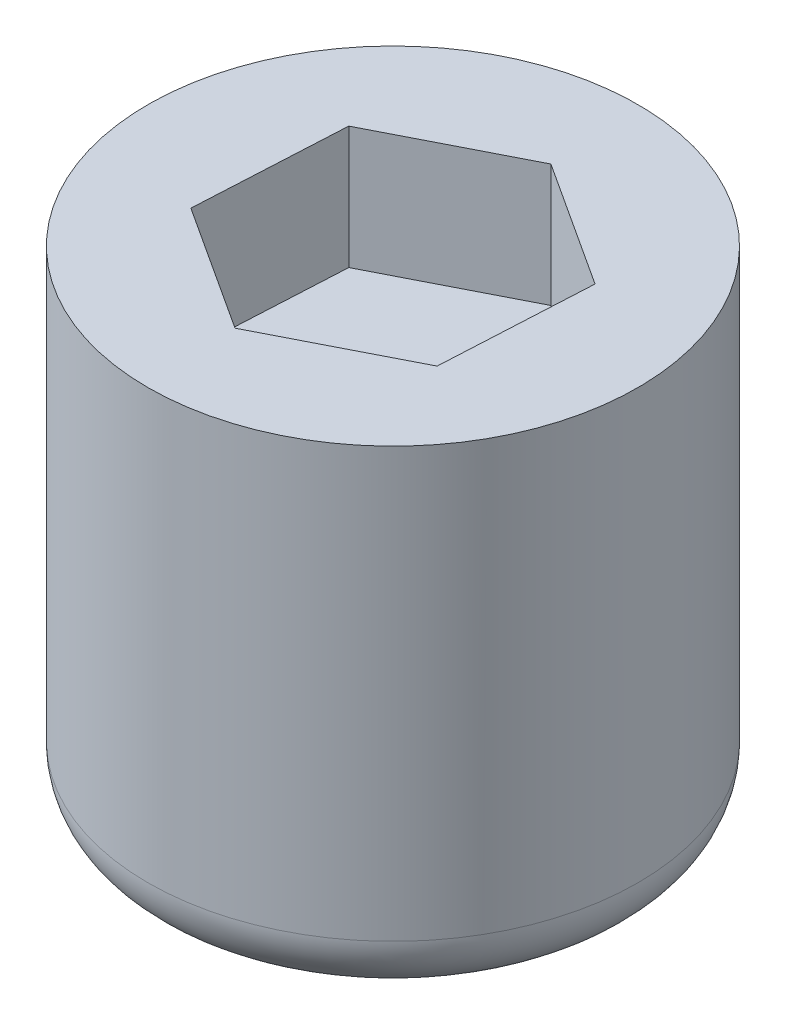
ISO-10303-21;
HEADER;
FILE_DESCRIPTION(('STEP AP214'),'2;1');
FILE_NAME('part.step','',(''),(''),'','','');
FILE_SCHEMA(('AUTOMOTIVE_DESIGN { 1 0 10303 214 1 1 1 1 }'));
ENDSEC;
DATA;
#1=APPLICATION_CONTEXT('core data for automotive mechanical design processes');
#2=APPLICATION_PROTOCOL_DEFINITION('international standard','automotive_design',2000,#1);
#3=PRODUCT_CONTEXT('',#1,'mechanical');
#4=PRODUCT('Part','Part','',(#3));
#5=PRODUCT_RELATED_PRODUCT_CATEGORY('part','',(#4));
#6=PRODUCT_DEFINITION_FORMATION('','',#4);
#7=PRODUCT_DEFINITION_CONTEXT('part definition',#1,'design');
#8=PRODUCT_DEFINITION('design','',#6,#7);
#9=PRODUCT_DEFINITION_SHAPE('','',#8);
#10=(LENGTH_UNIT() NAMED_UNIT(*) SI_UNIT(.MILLI.,.METRE.));
#11=(NAMED_UNIT(*) PLANE_ANGLE_UNIT() SI_UNIT($,.RADIAN.));
#12=(NAMED_UNIT(*) SI_UNIT($,.STERADIAN.) SOLID_ANGLE_UNIT());
#13=UNCERTAINTY_MEASURE_WITH_UNIT(LENGTH_MEASURE(1.E-05),#10,'distance_accuracy_value','');
#14=(GEOMETRIC_REPRESENTATION_CONTEXT(3) GLOBAL_UNCERTAINTY_ASSIGNED_CONTEXT((#13)) GLOBAL_UNIT_ASSIGNED_CONTEXT((#10,
#11,#12)) REPRESENTATION_CONTEXT('',''));
#15=CARTESIAN_POINT('',(0.,0.,0.));
#16=DIRECTION('',(0.,0.,1.));
#17=DIRECTION('',(1.,0.,0.));
#18=AXIS2_PLACEMENT_3D('',#15,#16,#17);
#19=CARTESIAN_POINT('',(0.,3.,0.));
#20=DIRECTION('',(0.,1.,0.));
#21=DIRECTION('',(0.,0.,1.));
#22=AXIS2_PLACEMENT_3D('',#19,#20,#21);
#23=PLANE('',#22);
#24=DIRECTION('',(0.891071488514059,0.,-0.45386297751341));
#25=VECTOR('',#24,1.);
#26=CARTESIAN_POINT('',(0.481996197668135,3.,0.946305582507161));
#27=LINE('',#26,#25);
#28=CARTESIAN_POINT('',(-0.0643535851280194,3.,1.22458621697923));
#29=VERTEX_POINT('',#28);
#30=CARTESIAN_POINT('',(1.02834598046429,3.,0.668024948035086));
#31=VERTEX_POINT('',#30);
#32=EDGE_CURVE('E81',#29,#31,#27,.T.);
#33=ORIENTED_EDGE('',*,*,#32,.T.);
#34=DIRECTION('',(0.0524788758931709,0.,-0.998622034397894));
#35=VECTOR('',#34,1.);
#36=CARTESIAN_POINT('',(1.0605227730283,3.,0.0557318395454692));
#37=LINE('',#36,#35);
#38=CARTESIAN_POINT('',(1.09269956559231,3.,-0.556561268944148));
#39=VERTEX_POINT('',#38);
#40=EDGE_CURVE('E66',#31,#39,#37,.T.);
#41=ORIENTED_EDGE('',*,*,#40,.T.);
#42=DIRECTION('',(-0.838592612620889,0.,-0.544759056884484));
#43=VECTOR('',#42,1.);
#44=CARTESIAN_POINT('',(0.578526575360164,3.,-0.890573742961691));
#45=LINE('',#44,#43);
#46=CARTESIAN_POINT('',(0.0643535851280199,3.,-1.22458621697923));
#47=VERTEX_POINT('',#46);
#48=EDGE_CURVE('E71',#39,#47,#45,.T.);
#49=ORIENTED_EDGE('',*,*,#48,.T.);
#50=DIRECTION('',(-0.891071488514059,0.,0.45386297751341));
#51=VECTOR('',#50,1.);
#52=CARTESIAN_POINT('',(-0.481996197668135,3.,-0.946305582507161));
#53=LINE('',#52,#51);
#54=CARTESIAN_POINT('',(-1.02834598046429,3.,-0.668024948035087));
#55=VERTEX_POINT('',#54);
#56=EDGE_CURVE('E104',#47,#55,#53,.T.);
#57=ORIENTED_EDGE('',*,*,#56,.T.);
#58=DIRECTION('',(-0.0524788758931708,0.,0.998622034397894));
#59=VECTOR('',#58,1.);
#60=CARTESIAN_POINT('',(-1.0605227730283,3.,-0.0557318395454693));
#61=LINE('',#60,#59);
#62=CARTESIAN_POINT('',(-1.09269956559231,3.,0.556561268944148));
#63=VERTEX_POINT('',#62);
#64=EDGE_CURVE('E99',#55,#63,#61,.T.);
#65=ORIENTED_EDGE('',*,*,#64,.T.);
#66=DIRECTION('',(0.838592612620888,0.,0.544759056884484));
#67=VECTOR('',#66,1.);
#68=CARTESIAN_POINT('',(-0.578526575360165,3.,0.890573742961692));
#69=LINE('',#68,#67);
#70=EDGE_CURVE('E95',#63,#29,#69,.T.);
#71=ORIENTED_EDGE('',*,*,#70,.T.);
#72=EDGE_LOOP('',(#33,#41,#49,#57,#65,#71));
#73=FACE_BOUND('',#72,.T.);
#74=ADVANCED_FACE('F17',(#73),#23,.T.);
#75=CARTESIAN_POINT('',(0.578526575360164,4.,-0.890573742961691));
#76=DIRECTION('',(0.544759056884484,0.,-0.838592612620889));
#77=DIRECTION('',(-0.838592612620889,0.,-0.544759056884484));
#78=AXIS2_PLACEMENT_3D('',#75,#76,#77);
#79=PLANE('',#78);
#80=DIRECTION('',(0.,1.,0.));
#81=VECTOR('',#80,1.);
#82=CARTESIAN_POINT('',(1.09269956559231,4.,-0.556561268944148));
#83=LINE('',#82,#81);
#84=CARTESIAN_POINT('',(1.09269956559231,4.,-0.556561268944148));
#85=VERTEX_POINT('',#84);
#86=EDGE_CURVE('E73',#39,#85,#83,.T.);
#87=ORIENTED_EDGE('',*,*,#86,.T.);
#88=DIRECTION('',(0.83859261262089,0.,0.544759056884481));
#89=VECTOR('',#88,1.);
#90=CARTESIAN_POINT('',(0.0643535851280194,4.,-1.22458621697923));
#91=LINE('',#90,#89);
#92=CARTESIAN_POINT('',(0.0643535851280198,4.,-1.22458621697923));
#93=VERTEX_POINT('',#92);
#94=EDGE_CURVE('E106',#93,#85,#91,.T.);
#95=ORIENTED_EDGE('',*,*,#94,.F.);
#96=DIRECTION('',(0.,1.,0.));
#97=VECTOR('',#96,1.);
#98=CARTESIAN_POINT('',(0.0643535851280176,4.,-1.22458621697923));
#99=LINE('',#98,#97);
#100=EDGE_CURVE('E76',#93,#47,#99,.F.);
#101=ORIENTED_EDGE('',*,*,#100,.T.);
#102=ORIENTED_EDGE('',*,*,#48,.F.);
#103=EDGE_LOOP('',(#87,#95,#101,#102));
#104=FACE_BOUND('',#103,.T.);
#105=ADVANCED_FACE('F72',(#104),#79,.F.);
#106=CARTESIAN_POINT('',(1.0605227730283,4.,0.0557318395454692));
#107=DIRECTION('',(0.998622034397894,0.,0.0524788758931709));
#108=DIRECTION('',(0.0524788758931709,0.,-0.998622034397894));
#109=AXIS2_PLACEMENT_3D('',#106,#107,#108);
#110=PLANE('',#109);
#111=DIRECTION('',(0.,1.,0.));
#112=VECTOR('',#111,1.);
#113=CARTESIAN_POINT('',(1.02834598046429,4.,0.668024948035087));
#114=LINE('',#113,#112);
#115=CARTESIAN_POINT('',(1.02834598046429,4.,0.668024948035086));
#116=VERTEX_POINT('',#115);
#117=EDGE_CURVE('E83',#31,#116,#114,.T.);
#118=ORIENTED_EDGE('',*,*,#117,.T.);
#119=DIRECTION('',(-0.0524788758931712,0.,0.998622034397894));
#120=VECTOR('',#119,1.);
#121=CARTESIAN_POINT('',(1.09269956559231,4.,-0.556561268944148));
#122=LINE('',#121,#120);
#123=EDGE_CURVE('E87',#85,#116,#122,.T.);
#124=ORIENTED_EDGE('',*,*,#123,.F.);
#125=ORIENTED_EDGE('',*,*,#86,.F.);
#126=ORIENTED_EDGE('',*,*,#40,.F.);
#127=EDGE_LOOP('',(#118,#124,#125,#126));
#128=FACE_BOUND('',#127,.T.);
#129=ADVANCED_FACE('F85',(#128),#110,.F.);
#130=CARTESIAN_POINT('',(0.481996197668135,4.,0.946305582507161));
#131=DIRECTION('',(0.45386297751341,0.,0.891071488514059));
#132=DIRECTION('',(0.891071488514059,0.,-0.45386297751341));
#133=AXIS2_PLACEMENT_3D('',#130,#131,#132);
#134=PLANE('',#133);
#135=DIRECTION('',(0.,1.,0.));
#136=VECTOR('',#135,1.);
#137=CARTESIAN_POINT('',(-0.0643535851280223,4.,1.22458621697923));
#138=LINE('',#137,#136);
#139=CARTESIAN_POINT('',(-0.0643535851280194,4.,1.22458621697923));
#140=VERTEX_POINT('',#139);
#141=EDGE_CURVE('E93',#29,#140,#138,.T.);
#142=ORIENTED_EDGE('',*,*,#141,.T.);
#143=DIRECTION('',(-0.891071488514061,0.,0.453862977513408));
#144=VECTOR('',#143,1.);
#145=CARTESIAN_POINT('',(1.02834598046429,4.,0.668024948035086));
#146=LINE('',#145,#144);
#147=EDGE_CURVE('E142',#116,#140,#146,.T.);
#148=ORIENTED_EDGE('',*,*,#147,.F.);
#149=ORIENTED_EDGE('',*,*,#117,.F.);
#150=ORIENTED_EDGE('',*,*,#32,.F.);
#151=EDGE_LOOP('',(#142,#148,#149,#150));
#152=FACE_BOUND('',#151,.T.);
#153=ADVANCED_FACE('F170',(#152),#134,.F.);
#154=CARTESIAN_POINT('',(-0.578526575360165,4.,0.890573742961692));
#155=DIRECTION('',(-0.544759056884484,0.,0.838592612620888));
#156=DIRECTION('',(0.838592612620888,0.,0.544759056884484));
#157=AXIS2_PLACEMENT_3D('',#154,#155,#156);
#158=PLANE('',#157);
#159=DIRECTION('',(0.,1.,0.));
#160=VECTOR('',#159,1.);
#161=CARTESIAN_POINT('',(-1.09269956559231,4.,0.556561268944148));
#162=LINE('',#161,#160);
#163=CARTESIAN_POINT('',(-1.09269956559231,4.,0.556561268944148));
#164=VERTEX_POINT('',#163);
#165=EDGE_CURVE('E97',#63,#164,#162,.T.);
#166=ORIENTED_EDGE('',*,*,#165,.T.);
#167=DIRECTION('',(-0.83859261262089,0.,-0.544759056884481));
#168=VECTOR('',#167,1.);
#169=CARTESIAN_POINT('',(-0.0643535851280198,4.,1.22458621697923));
#170=LINE('',#169,#168);
#171=EDGE_CURVE('E139',#140,#164,#170,.T.);
#172=ORIENTED_EDGE('',*,*,#171,.F.);
#173=ORIENTED_EDGE('',*,*,#141,.F.);
#174=ORIENTED_EDGE('',*,*,#70,.F.);
#175=EDGE_LOOP('',(#166,#172,#173,#174));
#176=FACE_BOUND('',#175,.T.);
#177=ADVANCED_FACE('F167',(#176),#158,.F.);
#178=CARTESIAN_POINT('',(-1.0605227730283,4.,-0.0557318395454693));
#179=DIRECTION('',(-0.998622034397894,0.,-0.0524788758931708));
#180=DIRECTION('',(-0.0524788758931708,0.,0.998622034397894));
#181=AXIS2_PLACEMENT_3D('',#178,#179,#180);
#182=PLANE('',#181);
#183=DIRECTION('',(0.,1.,0.));
#184=VECTOR('',#183,1.);
#185=CARTESIAN_POINT('',(-1.02834598046429,4.,-0.668024948035087));
#186=LINE('',#185,#184);
#187=CARTESIAN_POINT('',(-1.02834598046429,4.,-0.668024948035087));
#188=VERTEX_POINT('',#187);
#189=EDGE_CURVE('E34',#55,#188,#186,.T.);
#190=ORIENTED_EDGE('',*,*,#189,.T.);
#191=DIRECTION('',(0.0524788758931712,0.,-0.998622034397894));
#192=VECTOR('',#191,1.);
#193=CARTESIAN_POINT('',(-1.09269956559231,4.,0.556561268944148));
#194=LINE('',#193,#192);
#195=EDGE_CURVE('E136',#164,#188,#194,.T.);
#196=ORIENTED_EDGE('',*,*,#195,.F.);
#197=ORIENTED_EDGE('',*,*,#165,.F.);
#198=ORIENTED_EDGE('',*,*,#64,.F.);
#199=EDGE_LOOP('',(#190,#196,#197,#198));
#200=FACE_BOUND('',#199,.T.);
#201=ADVANCED_FACE('F163',(#200),#182,.F.);
#202=CARTESIAN_POINT('',(-0.481996197668135,4.,-0.946305582507161));
#203=DIRECTION('',(-0.45386297751341,0.,-0.891071488514059));
#204=DIRECTION('',(-0.891071488514059,0.,0.45386297751341));
#205=AXIS2_PLACEMENT_3D('',#202,#203,#204);
#206=PLANE('',#205);
#207=ORIENTED_EDGE('',*,*,#100,.F.);
#208=DIRECTION('',(0.891071488514061,0.,-0.453862977513407));
#209=VECTOR('',#208,1.);
#210=CARTESIAN_POINT('',(-1.02834598046429,4.,-0.668024948035087));
#211=LINE('',#210,#209);
#212=EDGE_CURVE('E132',#188,#93,#211,.T.);
#213=ORIENTED_EDGE('',*,*,#212,.F.);
#214=ORIENTED_EDGE('',*,*,#189,.F.);
#215=ORIENTED_EDGE('',*,*,#56,.F.);
#216=EDGE_LOOP('',(#207,#213,#214,#215));
#217=FACE_BOUND('',#216,.T.);
#218=ADVANCED_FACE('F160',(#217),#206,.F.);
#219=CARTESIAN_POINT('',(0.,0.,0.));
#220=DIRECTION('',(0.,1.,0.));
#221=DIRECTION('',(0.,0.,1.));
#222=AXIS2_PLACEMENT_3D('',#219,#220,#221);
#223=PLANE('',#222);
#224=CARTESIAN_POINT('',(0.,0.,0.));
#225=DIRECTION('',(0.,1.,0.));
#226=DIRECTION('',(1.,0.,0.));
#227=AXIS2_PLACEMENT_3D('',#224,#225,#226);
#228=CIRCLE('',#227,1.5);
#229=CARTESIAN_POINT('',(1.5,0.,0.));
#230=VERTEX_POINT('',#229);
#231=EDGE_CURVE('E135',#230,#230,#228,.T.);
#232=ORIENTED_EDGE('',*,*,#231,.F.);
#233=EDGE_LOOP('',(#232));
#234=FACE_BOUND('',#233,.T.);
#235=ADVANCED_FACE('F151',(#234),#223,.F.);
#236=CARTESIAN_POINT('',(0.,4.,0.));
#237=DIRECTION('',(0.,1.,0.));
#238=DIRECTION('',(0.,0.,1.));
#239=AXIS2_PLACEMENT_3D('',#236,#237,#238);
#240=PLANE('',#239);
#241=CARTESIAN_POINT('',(0.,4.,0.));
#242=DIRECTION('',(0.,1.,0.));
#243=DIRECTION('',(0.,0.,1.));
#244=AXIS2_PLACEMENT_3D('',#241,#242,#243);
#245=CIRCLE('',#244,2.);
#246=CARTESIAN_POINT('',(0.,4.,2.));
#247=VERTEX_POINT('',#246);
#248=EDGE_CURVE('E20',#247,#247,#245,.F.);
#249=ORIENTED_EDGE('',*,*,#248,.F.);
#250=EDGE_LOOP('',(#249));
#251=FACE_BOUND('',#250,.T.);
#252=ORIENTED_EDGE('',*,*,#195,.T.);
#253=ORIENTED_EDGE('',*,*,#212,.T.);
#254=ORIENTED_EDGE('',*,*,#94,.T.);
#255=ORIENTED_EDGE('',*,*,#123,.T.);
#256=ORIENTED_EDGE('',*,*,#147,.T.);
#257=ORIENTED_EDGE('',*,*,#171,.T.);
#258=EDGE_LOOP('',(#252,#253,#254,#255,#256,#257));
#259=FACE_BOUND('',#258,.T.);
#260=ADVANCED_FACE('F125',(#251,#259),#240,.T.);
#261=CARTESIAN_POINT('',(0.,0.5,0.));
#262=DIRECTION('',(0.,1.,0.));
#263=DIRECTION('',(1.,0.,0.));
#264=AXIS2_PLACEMENT_3D('',#261,#262,#263);
#265=TOROIDAL_SURFACE('',#264,1.5,0.5);
#266=CARTESIAN_POINT('',(0.,0.5,0.));
#267=DIRECTION('',(0.,1.,0.));
#268=DIRECTION('',(0.,0.,1.));
#269=AXIS2_PLACEMENT_3D('',#266,#267,#268);
#270=CIRCLE('',#269,2.);
#271=CARTESIAN_POINT('',(0.,0.5,2.));
#272=VERTEX_POINT('',#271);
#273=EDGE_CURVE('E11',#272,#272,#270,.T.);
#274=ORIENTED_EDGE('',*,*,#273,.F.);
#275=EDGE_LOOP('',(#274));
#276=FACE_BOUND('',#275,.T.);
#277=ORIENTED_EDGE('',*,*,#231,.T.);
#278=EDGE_LOOP('',(#277));
#279=FACE_BOUND('',#278,.T.);
#280=ADVANCED_FACE('F113',(#276,#279),#265,.T.);
#281=CARTESIAN_POINT('',(0.,0.,0.));
#282=DIRECTION('',(0.,1.,0.));
#283=DIRECTION('',(0.,0.,1.));
#284=AXIS2_PLACEMENT_3D('',#281,#282,#283);
#285=CYLINDRICAL_SURFACE('',#284,2.);
#286=ORIENTED_EDGE('',*,*,#273,.T.);
#287=EDGE_LOOP('',(#286));
#288=FACE_BOUND('',#287,.T.);
#289=ORIENTED_EDGE('',*,*,#248,.T.);
#290=EDGE_LOOP('',(#289));
#291=FACE_BOUND('',#290,.T.);
#292=ADVANCED_FACE('F124',(#288,#291),#285,.T.);
#293=CLOSED_SHELL('',(#74,#105,#129,#153,#177,#201,#218,#235,#260,#280,#292));
#294=MANIFOLD_SOLID_BREP('B1',#293);
#295=ADVANCED_BREP_SHAPE_REPRESENTATION('',(#18,#294),#14);
#296=SHAPE_DEFINITION_REPRESENTATION(#9,#295);
ENDSEC;
END-ISO-10303-21;
